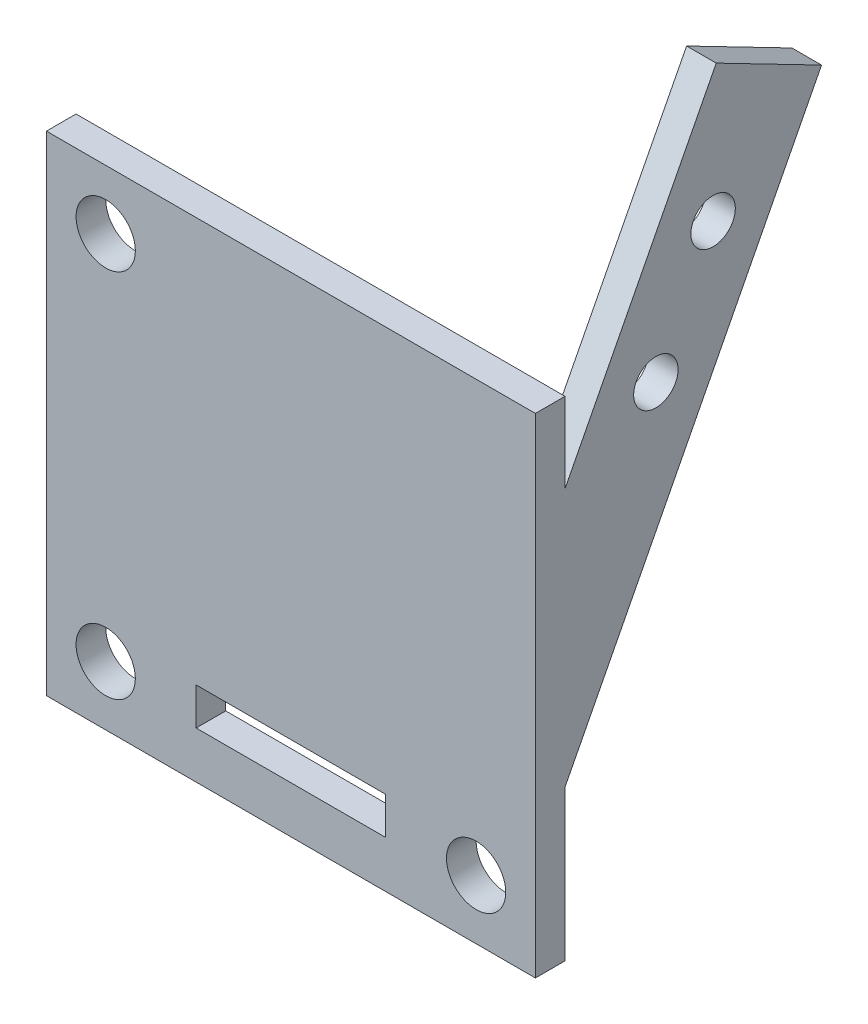
ISO-10303-21;
HEADER;
FILE_DESCRIPTION(('STEP AP214'),'2;1');
FILE_NAME('part.step','',(''),(''),'','','');
FILE_SCHEMA(('AUTOMOTIVE_DESIGN { 1 0 10303 214 1 1 1 1 }'));
ENDSEC;
DATA;
#1=APPLICATION_CONTEXT('core data for automotive mechanical design processes');
#2=APPLICATION_PROTOCOL_DEFINITION('international standard','automotive_design',2000,#1);
#3=PRODUCT_CONTEXT('',#1,'mechanical');
#4=PRODUCT('Part','Part','',(#3));
#5=PRODUCT_RELATED_PRODUCT_CATEGORY('part','',(#4));
#6=PRODUCT_DEFINITION_FORMATION('','',#4);
#7=PRODUCT_DEFINITION_CONTEXT('part definition',#1,'design');
#8=PRODUCT_DEFINITION('design','',#6,#7);
#9=PRODUCT_DEFINITION_SHAPE('','',#8);
#10=(LENGTH_UNIT() NAMED_UNIT(*) SI_UNIT(.MILLI.,.METRE.));
#11=(NAMED_UNIT(*) PLANE_ANGLE_UNIT() SI_UNIT($,.RADIAN.));
#12=(NAMED_UNIT(*) SI_UNIT($,.STERADIAN.) SOLID_ANGLE_UNIT());
#13=UNCERTAINTY_MEASURE_WITH_UNIT(LENGTH_MEASURE(1.E-05),#10,'distance_accuracy_value','');
#14=(GEOMETRIC_REPRESENTATION_CONTEXT(3) GLOBAL_UNCERTAINTY_ASSIGNED_CONTEXT((#13)) GLOBAL_UNIT_ASSIGNED_CONTEXT((#10,
#11,#12)) REPRESENTATION_CONTEXT('',''));
#15=CARTESIAN_POINT('',(0.,0.,0.));
#16=DIRECTION('',(0.,0.,1.));
#17=DIRECTION('',(1.,0.,0.));
#18=AXIS2_PLACEMENT_3D('',#15,#16,#17);
#19=CARTESIAN_POINT('',(0.,0.,0.));
#20=DIRECTION('',(0.,0.,1.));
#21=DIRECTION('',(1.,0.,0.));
#22=AXIS2_PLACEMENT_3D('',#19,#20,#21);
#23=PLANE('',#22);
#24=CARTESIAN_POINT('',(-12.5,12.5,0.));
#25=DIRECTION('',(0.,0.,-1.));
#26=DIRECTION('',(-1.,0.,0.));
#27=AXIS2_PLACEMENT_3D('',#24,#25,#26);
#28=CIRCLE('',#27,2.);
#29=CARTESIAN_POINT('',(-14.5,12.5,0.));
#30=VERTEX_POINT('',#29);
#31=EDGE_CURVE('E300',#30,#30,#28,.T.);
#32=ORIENTED_EDGE('',*,*,#31,.F.);
#33=EDGE_LOOP('',(#32));
#34=FACE_BOUND('',#33,.T.);
#35=CARTESIAN_POINT('',(-12.5,-12.5,0.));
#36=DIRECTION('',(0.,0.,-1.));
#37=DIRECTION('',(-1.,0.,0.));
#38=AXIS2_PLACEMENT_3D('',#35,#36,#37);
#39=CIRCLE('',#38,2.);
#40=CARTESIAN_POINT('',(-14.5,-12.5,0.));
#41=VERTEX_POINT('',#40);
#42=EDGE_CURVE('E290',#41,#41,#39,.T.);
#43=ORIENTED_EDGE('',*,*,#42,.F.);
#44=EDGE_LOOP('',(#43));
#45=FACE_BOUND('',#44,.T.);
#46=CARTESIAN_POINT('',(12.5,-12.5,0.));
#47=DIRECTION('',(0.,0.,-1.));
#48=DIRECTION('',(-1.,0.,0.));
#49=AXIS2_PLACEMENT_3D('',#46,#47,#48);
#50=CIRCLE('',#49,2.);
#51=CARTESIAN_POINT('',(10.5,-12.5,0.));
#52=VERTEX_POINT('',#51);
#53=EDGE_CURVE('E291',#52,#52,#50,.T.);
#54=ORIENTED_EDGE('',*,*,#53,.F.);
#55=EDGE_LOOP('',(#54));
#56=FACE_BOUND('',#55,.T.);
#57=DIRECTION('',(0.,-1.,0.));
#58=VECTOR('',#57,1.);
#59=CARTESIAN_POINT('',(6.39907242727323,-10.8175668460402,0.));
#60=LINE('',#59,#58);
#61=CARTESIAN_POINT('',(6.39907242727323,-10.8175668460402,0.));
#62=VERTEX_POINT('',#61);
#63=CARTESIAN_POINT('',(6.39907242727323,-13.3374088381271,0.));
#64=VERTEX_POINT('',#63);
#65=EDGE_CURVE('E146',#62,#64,#60,.T.);
#66=ORIENTED_EDGE('',*,*,#65,.F.);
#67=DIRECTION('',(1.,0.,0.));
#68=VECTOR('',#67,1.);
#69=CARTESIAN_POINT('',(6.39907242727323,-10.8175668460402,0.));
#70=LINE('',#69,#68);
#71=CARTESIAN_POINT('',(-6.39907242727323,-10.8175668460402,0.));
#72=VERTEX_POINT('',#71);
#73=EDGE_CURVE('E139',#72,#62,#70,.T.);
#74=ORIENTED_EDGE('',*,*,#73,.F.);
#75=DIRECTION('',(0.,1.,0.));
#76=VECTOR('',#75,1.);
#77=CARTESIAN_POINT('',(-6.39907242727323,-10.8175668460402,0.));
#78=LINE('',#77,#76);
#79=CARTESIAN_POINT('',(-6.39907242727323,-13.3374088381271,0.));
#80=VERTEX_POINT('',#79);
#81=EDGE_CURVE('E150',#80,#72,#78,.T.);
#82=ORIENTED_EDGE('',*,*,#81,.F.);
#83=DIRECTION('',(-1.,0.,0.));
#84=VECTOR('',#83,1.);
#85=CARTESIAN_POINT('',(6.39907242727323,-13.3374088381271,0.));
#86=LINE('',#85,#84);
#87=EDGE_CURVE('E48',#64,#80,#86,.T.);
#88=ORIENTED_EDGE('',*,*,#87,.F.);
#89=EDGE_LOOP('',(#66,#74,#82,#88));
#90=FACE_BOUND('',#89,.T.);
#91=DIRECTION('',(1.,0.,0.));
#92=VECTOR('',#91,1.);
#93=CARTESIAN_POINT('',(14.5,11.1002225544745,0.));
#94=LINE('',#93,#92);
#95=CARTESIAN_POINT('',(14.5,11.1002225544745,0.));
#96=VERTEX_POINT('',#95);
#97=CARTESIAN_POINT('',(16.5,11.1002225544745,0.));
#98=VERTEX_POINT('',#97);
#99=EDGE_CURVE('E196',#96,#98,#94,.T.);
#100=ORIENTED_EDGE('',*,*,#99,.F.);
#101=DIRECTION('',(0.,-1.,0.));
#102=VECTOR('',#101,1.);
#103=CARTESIAN_POINT('',(14.5,11.1002225544745,0.));
#104=LINE('',#103,#102);
#105=CARTESIAN_POINT('',(14.5,-6.34228866521879,0.));
#106=VERTEX_POINT('',#105);
#107=EDGE_CURVE('E182',#96,#106,#104,.T.);
#108=ORIENTED_EDGE('',*,*,#107,.T.);
#109=DIRECTION('',(1.,0.,0.));
#110=VECTOR('',#109,1.);
#111=CARTESIAN_POINT('',(14.5,-6.34228866521879,0.));
#112=LINE('',#111,#110);
#113=CARTESIAN_POINT('',(16.5,-6.34228866521878,0.));
#114=VERTEX_POINT('',#113);
#115=EDGE_CURVE('E192',#106,#114,#112,.T.);
#116=ORIENTED_EDGE('',*,*,#115,.T.);
#117=DIRECTION('',(0.,1.,0.));
#118=VECTOR('',#117,1.);
#119=CARTESIAN_POINT('',(16.5,16.5,0.));
#120=LINE('',#119,#118);
#121=CARTESIAN_POINT('',(16.5,-16.5,0.));
#122=VERTEX_POINT('',#121);
#123=EDGE_CURVE('E213',#122,#114,#120,.T.);
#124=ORIENTED_EDGE('',*,*,#123,.F.);
#125=DIRECTION('',(1.,0.,0.));
#126=VECTOR('',#125,1.);
#127=CARTESIAN_POINT('',(-16.5,-16.5,0.));
#128=LINE('',#127,#126);
#129=CARTESIAN_POINT('',(-16.5,-16.5,0.));
#130=VERTEX_POINT('',#129);
#131=EDGE_CURVE('E206',#130,#122,#128,.T.);
#132=ORIENTED_EDGE('',*,*,#131,.F.);
#133=DIRECTION('',(0.,-1.,0.));
#134=VECTOR('',#133,1.);
#135=CARTESIAN_POINT('',(-16.5,16.5,0.));
#136=LINE('',#135,#134);
#137=CARTESIAN_POINT('',(-16.5,16.5,0.));
#138=VERTEX_POINT('',#137);
#139=EDGE_CURVE('E218',#138,#130,#136,.T.);
#140=ORIENTED_EDGE('',*,*,#139,.F.);
#141=DIRECTION('',(-1.,0.,0.));
#142=VECTOR('',#141,1.);
#143=CARTESIAN_POINT('',(-16.5,16.5,0.));
#144=LINE('',#143,#142);
#145=CARTESIAN_POINT('',(16.5,16.5,0.));
#146=VERTEX_POINT('',#145);
#147=EDGE_CURVE('E216',#146,#138,#144,.T.);
#148=ORIENTED_EDGE('',*,*,#147,.F.);
#149=EDGE_CURVE('E195',#98,#146,#120,.T.);
#150=ORIENTED_EDGE('',*,*,#149,.F.);
#151=EDGE_LOOP('',(#100,#108,#116,#124,#132,#140,#148,#150));
#152=FACE_BOUND('',#151,.T.);
#153=ADVANCED_FACE('F33',(#34,#45,#56,#90,#152),#23,.F.);
#154=CARTESIAN_POINT('',(16.5,16.5,2.));
#155=DIRECTION('',(-1.,0.,0.));
#156=DIRECTION('',(0.,0.,1.));
#157=AXIS2_PLACEMENT_3D('',#154,#155,#156);
#158=PLANE('',#157);
#159=CARTESIAN_POINT('',(16.5,21.7430272293726,-9.99453678843321));
#160=DIRECTION('',(1.,0.,0.));
#161=DIRECTION('',(0.,0.,-1.));
#162=AXIS2_PLACEMENT_3D('',#159,#160,#161);
#163=CIRCLE('',#162,1.5);
#164=CARTESIAN_POINT('',(16.5,21.7430272293726,-11.4945367884332));
#165=VERTEX_POINT('',#164);
#166=EDGE_CURVE('E159',#165,#165,#163,.T.);
#167=ORIENTED_EDGE('',*,*,#166,.F.);
#168=EDGE_LOOP('',(#167));
#169=FACE_BOUND('',#168,.T.);
#170=CARTESIAN_POINT('',(16.5,14.2585598983655,-6.13151513999784));
#171=DIRECTION('',(1.,0.,0.));
#172=DIRECTION('',(0.,0.,-1.));
#173=AXIS2_PLACEMENT_3D('',#170,#171,#172);
#174=CIRCLE('',#173,1.5);
#175=CARTESIAN_POINT('',(16.5,14.2585598983655,-7.63151513999784));
#176=VERTEX_POINT('',#175);
#177=EDGE_CURVE('E165',#176,#176,#174,.T.);
#178=ORIENTED_EDGE('',*,*,#177,.F.);
#179=EDGE_LOOP('',(#178));
#180=FACE_BOUND('',#179,.T.);
#181=ORIENTED_EDGE('',*,*,#123,.T.);
#182=DIRECTION('',(0.,0.888617232654948,-0.458649554484316));
#183=VECTOR('',#182,1.);
#184=CARTESIAN_POINT('',(16.5,0.544368726690588,-3.55446893061979));
#185=LINE('',#184,#183);
#186=CARTESIAN_POINT('',(16.5,27.202885706339,-17.3139555651493));
#187=VERTEX_POINT('',#186);
#188=EDGE_CURVE('E176',#114,#187,#185,.T.);
#189=ORIENTED_EDGE('',*,*,#188,.T.);
#190=DIRECTION('',(0.,0.458649554484316,0.888617232654948));
#191=VECTOR('',#190,1.);
#192=CARTESIAN_POINT('',(16.5,30.8720821422136,-10.2050177039097));
#193=LINE('',#192,#191);
#194=CARTESIAN_POINT('',(16.5,30.8720821422136,-10.2050177039097));
#195=VERTEX_POINT('',#194);
#196=EDGE_CURVE('E171',#187,#195,#193,.T.);
#197=ORIENTED_EDGE('',*,*,#196,.T.);
#198=DIRECTION('',(0.,-0.888617232654948,0.458649554484316));
#199=VECTOR('',#198,1.);
#200=CARTESIAN_POINT('',(16.5,11.1002225544745,0.));
#201=LINE('',#200,#199);
#202=EDGE_CURVE('E188',#195,#98,#201,.T.);
#203=ORIENTED_EDGE('',*,*,#202,.T.);
#204=ORIENTED_EDGE('',*,*,#149,.T.);
#205=DIRECTION('',(0.,0.,-1.));
#206=VECTOR('',#205,1.);
#207=CARTESIAN_POINT('',(16.5,16.5,2.));
#208=LINE('',#207,#206);
#209=CARTESIAN_POINT('',(16.5,16.5,2.));
#210=VERTEX_POINT('',#209);
#211=EDGE_CURVE('E11',#210,#146,#208,.T.);
#212=ORIENTED_EDGE('',*,*,#211,.F.);
#213=DIRECTION('',(0.,1.,0.));
#214=VECTOR('',#213,1.);
#215=CARTESIAN_POINT('',(16.5,16.5,2.));
#216=LINE('',#215,#214);
#217=CARTESIAN_POINT('',(16.5,-16.5,2.));
#218=VERTEX_POINT('',#217);
#219=EDGE_CURVE('E202',#218,#210,#216,.T.);
#220=ORIENTED_EDGE('',*,*,#219,.F.);
#221=DIRECTION('',(0.,0.,-1.));
#222=VECTOR('',#221,1.);
#223=CARTESIAN_POINT('',(16.5,-16.5,2.));
#224=LINE('',#223,#222);
#225=EDGE_CURVE('E212',#218,#122,#224,.T.);
#226=ORIENTED_EDGE('',*,*,#225,.T.);
#227=EDGE_LOOP('',(#181,#189,#197,#203,#204,#212,#220,#226));
#228=FACE_BOUND('',#227,.T.);
#229=ADVANCED_FACE('F35',(#169,#180,#228),#158,.F.);
#230=CARTESIAN_POINT('',(-16.5,16.5,2.));
#231=DIRECTION('',(0.,-1.,0.));
#232=DIRECTION('',(0.,0.,-1.));
#233=AXIS2_PLACEMENT_3D('',#230,#231,#232);
#234=PLANE('',#233);
#235=ORIENTED_EDGE('',*,*,#147,.T.);
#236=DIRECTION('',(0.,0.,-1.));
#237=VECTOR('',#236,1.);
#238=CARTESIAN_POINT('',(-16.5,16.5,2.));
#239=LINE('',#238,#237);
#240=CARTESIAN_POINT('',(-16.5,16.5,2.));
#241=VERTEX_POINT('',#240);
#242=EDGE_CURVE('E41',#241,#138,#239,.T.);
#243=ORIENTED_EDGE('',*,*,#242,.F.);
#244=DIRECTION('',(-1.,0.,0.));
#245=VECTOR('',#244,1.);
#246=CARTESIAN_POINT('',(-16.5,16.5,2.));
#247=LINE('',#246,#245);
#248=EDGE_CURVE('E205',#210,#241,#247,.T.);
#249=ORIENTED_EDGE('',*,*,#248,.F.);
#250=ORIENTED_EDGE('',*,*,#211,.T.);
#251=EDGE_LOOP('',(#235,#243,#249,#250));
#252=FACE_BOUND('',#251,.T.);
#253=ADVANCED_FACE('F246',(#252),#234,.F.);
#254=CARTESIAN_POINT('',(-16.5,16.5,2.));
#255=DIRECTION('',(1.,0.,0.));
#256=DIRECTION('',(0.,1.,0.));
#257=AXIS2_PLACEMENT_3D('',#254,#255,#256);
#258=PLANE('',#257);
#259=ORIENTED_EDGE('',*,*,#139,.T.);
#260=DIRECTION('',(0.,0.,-1.));
#261=VECTOR('',#260,1.);
#262=CARTESIAN_POINT('',(-16.5,-16.5,2.));
#263=LINE('',#262,#261);
#264=CARTESIAN_POINT('',(-16.5,-16.5,2.));
#265=VERTEX_POINT('',#264);
#266=EDGE_CURVE('E223',#265,#130,#263,.T.);
#267=ORIENTED_EDGE('',*,*,#266,.F.);
#268=DIRECTION('',(0.,-1.,0.));
#269=VECTOR('',#268,1.);
#270=CARTESIAN_POINT('',(-16.5,16.5,2.));
#271=LINE('',#270,#269);
#272=EDGE_CURVE('E208',#241,#265,#271,.T.);
#273=ORIENTED_EDGE('',*,*,#272,.F.);
#274=ORIENTED_EDGE('',*,*,#242,.T.);
#275=EDGE_LOOP('',(#259,#267,#273,#274));
#276=FACE_BOUND('',#275,.T.);
#277=ADVANCED_FACE('F230',(#276),#258,.F.);
#278=CARTESIAN_POINT('',(-16.5,-16.5,2.));
#279=DIRECTION('',(0.,1.,0.));
#280=DIRECTION('',(0.,0.,1.));
#281=AXIS2_PLACEMENT_3D('',#278,#279,#280);
#282=PLANE('',#281);
#283=ORIENTED_EDGE('',*,*,#131,.T.);
#284=ORIENTED_EDGE('',*,*,#225,.F.);
#285=DIRECTION('',(1.,0.,0.));
#286=VECTOR('',#285,1.);
#287=CARTESIAN_POINT('',(-16.5,-16.5,2.));
#288=LINE('',#287,#286);
#289=EDGE_CURVE('E210',#265,#218,#288,.T.);
#290=ORIENTED_EDGE('',*,*,#289,.F.);
#291=ORIENTED_EDGE('',*,*,#266,.T.);
#292=EDGE_LOOP('',(#283,#284,#290,#291));
#293=FACE_BOUND('',#292,.T.);
#294=ADVANCED_FACE('F241',(#293),#282,.F.);
#295=CARTESIAN_POINT('',(0.,0.,2.));
#296=DIRECTION('',(0.,0.,1.));
#297=DIRECTION('',(1.,0.,0.));
#298=AXIS2_PLACEMENT_3D('',#295,#296,#297);
#299=PLANE('',#298);
#300=CARTESIAN_POINT('',(-12.5,12.5,2.));
#301=DIRECTION('',(0.,0.,1.));
#302=DIRECTION('',(1.,0.,0.));
#303=AXIS2_PLACEMENT_3D('',#300,#301,#302);
#304=CIRCLE('',#303,2.);
#305=CARTESIAN_POINT('',(-10.5,12.5,2.));
#306=VERTEX_POINT('',#305);
#307=EDGE_CURVE('E281',#306,#306,#304,.F.);
#308=ORIENTED_EDGE('',*,*,#307,.T.);
#309=EDGE_LOOP('',(#308));
#310=FACE_BOUND('',#309,.T.);
#311=CARTESIAN_POINT('',(-12.5,-12.5,2.));
#312=DIRECTION('',(0.,0.,1.));
#313=DIRECTION('',(1.,0.,0.));
#314=AXIS2_PLACEMENT_3D('',#311,#312,#313);
#315=CIRCLE('',#314,2.);
#316=CARTESIAN_POINT('',(-10.5,-12.5,2.));
#317=VERTEX_POINT('',#316);
#318=EDGE_CURVE('E285',#317,#317,#315,.F.);
#319=ORIENTED_EDGE('',*,*,#318,.T.);
#320=EDGE_LOOP('',(#319));
#321=FACE_BOUND('',#320,.T.);
#322=CARTESIAN_POINT('',(12.5,-12.5,2.));
#323=DIRECTION('',(0.,0.,1.));
#324=DIRECTION('',(1.,0.,0.));
#325=AXIS2_PLACEMENT_3D('',#322,#323,#324);
#326=CIRCLE('',#325,2.);
#327=CARTESIAN_POINT('',(14.5,-12.5,2.));
#328=VERTEX_POINT('',#327);
#329=EDGE_CURVE('E288',#328,#328,#326,.F.);
#330=ORIENTED_EDGE('',*,*,#329,.T.);
#331=EDGE_LOOP('',(#330));
#332=FACE_BOUND('',#331,.T.);
#333=DIRECTION('',(1.,0.,0.));
#334=VECTOR('',#333,1.);
#335=CARTESIAN_POINT('',(6.39907242727323,-10.8175668460402,2.));
#336=LINE('',#335,#334);
#337=CARTESIAN_POINT('',(-6.39907242727323,-10.8175668460402,2.));
#338=VERTEX_POINT('',#337);
#339=CARTESIAN_POINT('',(6.39907242727323,-10.8175668460402,2.));
#340=VERTEX_POINT('',#339);
#341=EDGE_CURVE('E136',#338,#340,#336,.T.);
#342=ORIENTED_EDGE('',*,*,#341,.T.);
#343=DIRECTION('',(0.,-1.,0.));
#344=VECTOR('',#343,1.);
#345=CARTESIAN_POINT('',(6.39907242727323,-10.8175668460402,2.));
#346=LINE('',#345,#344);
#347=CARTESIAN_POINT('',(6.39907242727323,-13.3374088381271,2.));
#348=VERTEX_POINT('',#347);
#349=EDGE_CURVE('E123',#340,#348,#346,.T.);
#350=ORIENTED_EDGE('',*,*,#349,.T.);
#351=DIRECTION('',(-1.,0.,0.));
#352=VECTOR('',#351,1.);
#353=CARTESIAN_POINT('',(6.39907242727323,-13.3374088381271,2.));
#354=LINE('',#353,#352);
#355=CARTESIAN_POINT('',(-6.39907242727323,-13.3374088381271,2.));
#356=VERTEX_POINT('',#355);
#357=EDGE_CURVE('E154',#348,#356,#354,.T.);
#358=ORIENTED_EDGE('',*,*,#357,.T.);
#359=DIRECTION('',(0.,1.,0.));
#360=VECTOR('',#359,1.);
#361=CARTESIAN_POINT('',(-6.39907242727323,-10.8175668460402,2.));
#362=LINE('',#361,#360);
#363=EDGE_CURVE('E144',#356,#338,#362,.T.);
#364=ORIENTED_EDGE('',*,*,#363,.T.);
#365=EDGE_LOOP('',(#342,#350,#358,#364));
#366=FACE_BOUND('',#365,.T.);
#367=ORIENTED_EDGE('',*,*,#219,.T.);
#368=ORIENTED_EDGE('',*,*,#248,.T.);
#369=ORIENTED_EDGE('',*,*,#272,.T.);
#370=ORIENTED_EDGE('',*,*,#289,.T.);
#371=EDGE_LOOP('',(#367,#368,#369,#370));
#372=FACE_BOUND('',#371,.T.);
#373=ADVANCED_FACE('F142',(#310,#321,#332,#366,#372),#299,.T.);
#374=CARTESIAN_POINT('',(14.5,0.544368726690588,-3.55446893061979));
#375=DIRECTION('',(0.,-0.458649554484316,-0.888617232654948));
#376=DIRECTION('',(0.,0.888617232654949,-0.458649554484316));
#377=AXIS2_PLACEMENT_3D('',#374,#375,#376);
#378=PLANE('',#377);
#379=ORIENTED_EDGE('',*,*,#188,.F.);
#380=ORIENTED_EDGE('',*,*,#115,.F.);
#381=DIRECTION('',(0.,0.888617232654948,-0.458649554484316));
#382=VECTOR('',#381,1.);
#383=CARTESIAN_POINT('',(14.5,0.544368726690588,-3.55446893061979));
#384=LINE('',#383,#382);
#385=CARTESIAN_POINT('',(14.5,27.202885706339,-17.3139555651493));
#386=VERTEX_POINT('',#385);
#387=EDGE_CURVE('E172',#106,#386,#384,.T.);
#388=ORIENTED_EDGE('',*,*,#387,.T.);
#389=DIRECTION('',(1.,0.,0.));
#390=VECTOR('',#389,1.);
#391=CARTESIAN_POINT('',(14.5,27.202885706339,-17.3139555651493));
#392=LINE('',#391,#390);
#393=EDGE_CURVE('E185',#386,#187,#392,.T.);
#394=ORIENTED_EDGE('',*,*,#393,.T.);
#395=EDGE_LOOP('',(#379,#380,#388,#394));
#396=FACE_BOUND('',#395,.T.);
#397=ADVANCED_FACE('F270',(#396),#378,.T.);
#398=CARTESIAN_POINT('',(14.5,11.1002225544745,0.));
#399=DIRECTION('',(0.,0.458649554484316,0.888617232654948));
#400=DIRECTION('',(0.,-0.888617232654948,0.458649554484316));
#401=AXIS2_PLACEMENT_3D('',#398,#399,#400);
#402=PLANE('',#401);
#403=ORIENTED_EDGE('',*,*,#202,.F.);
#404=DIRECTION('',(1.,0.,0.));
#405=VECTOR('',#404,1.);
#406=CARTESIAN_POINT('',(14.5,30.8720821422136,-10.2050177039097));
#407=LINE('',#406,#405);
#408=CARTESIAN_POINT('',(14.5,30.8720821422136,-10.2050177039097));
#409=VERTEX_POINT('',#408);
#410=EDGE_CURVE('E198',#409,#195,#407,.T.);
#411=ORIENTED_EDGE('',*,*,#410,.F.);
#412=DIRECTION('',(0.,-0.888617232654948,0.458649554484316));
#413=VECTOR('',#412,1.);
#414=CARTESIAN_POINT('',(14.5,11.1002225544745,0.));
#415=LINE('',#414,#413);
#416=EDGE_CURVE('E179',#409,#96,#415,.T.);
#417=ORIENTED_EDGE('',*,*,#416,.T.);
#418=ORIENTED_EDGE('',*,*,#99,.T.);
#419=EDGE_LOOP('',(#403,#411,#417,#418));
#420=FACE_BOUND('',#419,.T.);
#421=ADVANCED_FACE('F275',(#420),#402,.T.);
#422=CARTESIAN_POINT('',(14.5,30.8720821422136,-10.2050177039097));
#423=DIRECTION('',(0.,0.888617232654948,-0.458649554484316));
#424=DIRECTION('',(0.,0.458649554484316,0.888617232654948));
#425=AXIS2_PLACEMENT_3D('',#422,#423,#424);
#426=PLANE('',#425);
#427=ORIENTED_EDGE('',*,*,#196,.F.);
#428=ORIENTED_EDGE('',*,*,#393,.F.);
#429=DIRECTION('',(0.,0.458649554484316,0.888617232654948));
#430=VECTOR('',#429,1.);
#431=CARTESIAN_POINT('',(14.5,30.8720821422136,-10.2050177039097));
#432=LINE('',#431,#430);
#433=EDGE_CURVE('E175',#386,#409,#432,.T.);
#434=ORIENTED_EDGE('',*,*,#433,.T.);
#435=ORIENTED_EDGE('',*,*,#410,.T.);
#436=EDGE_LOOP('',(#427,#428,#434,#435));
#437=FACE_BOUND('',#436,.T.);
#438=ADVANCED_FACE('F340',(#437),#426,.T.);
#439=CARTESIAN_POINT('',(14.5,0.,0.));
#440=DIRECTION('',(-1.,0.,0.));
#441=DIRECTION('',(0.,0.,1.));
#442=AXIS2_PLACEMENT_3D('',#439,#440,#441);
#443=PLANE('',#442);
#444=CARTESIAN_POINT('',(14.5,21.7430272293726,-9.99453678843321));
#445=DIRECTION('',(-1.,0.,0.));
#446=DIRECTION('',(0.,0.,1.));
#447=AXIS2_PLACEMENT_3D('',#444,#445,#446);
#448=CIRCLE('',#447,1.5);
#449=CARTESIAN_POINT('',(14.5,21.7430272293726,-8.49453678843321));
#450=VERTEX_POINT('',#449);
#451=EDGE_CURVE('E162',#450,#450,#448,.F.);
#452=ORIENTED_EDGE('',*,*,#451,.T.);
#453=EDGE_LOOP('',(#452));
#454=FACE_BOUND('',#453,.T.);
#455=CARTESIAN_POINT('',(14.5,14.2585598983655,-6.13151513999784));
#456=DIRECTION('',(-1.,0.,0.));
#457=DIRECTION('',(0.,0.,1.));
#458=AXIS2_PLACEMENT_3D('',#455,#456,#457);
#459=CIRCLE('',#458,1.5);
#460=CARTESIAN_POINT('',(14.5,14.2585598983655,-4.63151513999784));
#461=VERTEX_POINT('',#460);
#462=EDGE_CURVE('E168',#461,#461,#459,.F.);
#463=ORIENTED_EDGE('',*,*,#462,.T.);
#464=EDGE_LOOP('',(#463));
#465=FACE_BOUND('',#464,.T.);
#466=ORIENTED_EDGE('',*,*,#387,.F.);
#467=ORIENTED_EDGE('',*,*,#107,.F.);
#468=ORIENTED_EDGE('',*,*,#416,.F.);
#469=ORIENTED_EDGE('',*,*,#433,.F.);
#470=EDGE_LOOP('',(#466,#467,#468,#469));
#471=FACE_BOUND('',#470,.T.);
#472=ADVANCED_FACE('F337',(#454,#465,#471),#443,.T.);
#473=CARTESIAN_POINT('',(10.2573593128807,14.2585598983655,-6.13151513999784));
#474=DIRECTION('',(1.,0.,0.));
#475=DIRECTION('',(0.,0.,-1.));
#476=AXIS2_PLACEMENT_3D('',#473,#474,#475);
#477=CYLINDRICAL_SURFACE('',#476,1.5);
#478=ORIENTED_EDGE('',*,*,#177,.T.);
#479=EDGE_LOOP('',(#478));
#480=FACE_BOUND('',#479,.T.);
#481=ORIENTED_EDGE('',*,*,#462,.F.);
#482=EDGE_LOOP('',(#481));
#483=FACE_BOUND('',#482,.T.);
#484=ADVANCED_FACE('F333',(#480,#483),#477,.F.);
#485=CARTESIAN_POINT('',(10.2573593128807,21.7430272293726,-9.99453678843321));
#486=DIRECTION('',(1.,0.,0.));
#487=DIRECTION('',(0.,0.,-1.));
#488=AXIS2_PLACEMENT_3D('',#485,#486,#487);
#489=CYLINDRICAL_SURFACE('',#488,1.5);
#490=ORIENTED_EDGE('',*,*,#166,.T.);
#491=EDGE_LOOP('',(#490));
#492=FACE_BOUND('',#491,.T.);
#493=ORIENTED_EDGE('',*,*,#451,.F.);
#494=EDGE_LOOP('',(#493));
#495=FACE_BOUND('',#494,.T.);
#496=ADVANCED_FACE('F330',(#492,#495),#489,.F.);
#497=CARTESIAN_POINT('',(6.39907242727323,-10.8175668460402,15.0438535480524));
#498=DIRECTION('',(0.,1.,0.));
#499=DIRECTION('',(0.,0.,1.));
#500=AXIS2_PLACEMENT_3D('',#497,#498,#499);
#501=PLANE('',#500);
#502=DIRECTION('',(0.,0.,-1.));
#503=VECTOR('',#502,1.);
#504=CARTESIAN_POINT('',(-6.39907242727323,-10.8175668460402,15.0438535480524));
#505=LINE('',#504,#503);
#506=EDGE_CURVE('E56',#338,#72,#505,.T.);
#507=ORIENTED_EDGE('',*,*,#506,.T.);
#508=ORIENTED_EDGE('',*,*,#73,.T.);
#509=DIRECTION('',(0.,0.,-1.));
#510=VECTOR('',#509,1.);
#511=CARTESIAN_POINT('',(6.39907242727323,-10.8175668460402,15.0438535480524));
#512=LINE('',#511,#510);
#513=EDGE_CURVE('E127',#340,#62,#512,.T.);
#514=ORIENTED_EDGE('',*,*,#513,.F.);
#515=ORIENTED_EDGE('',*,*,#341,.F.);
#516=EDGE_LOOP('',(#507,#508,#514,#515));
#517=FACE_BOUND('',#516,.T.);
#518=ADVANCED_FACE('F135',(#517),#501,.F.);
#519=CARTESIAN_POINT('',(6.39907242727323,-10.8175668460402,15.0438535480524));
#520=DIRECTION('',(1.,0.,0.));
#521=DIRECTION('',(0.,0.,-1.));
#522=AXIS2_PLACEMENT_3D('',#519,#520,#521);
#523=PLANE('',#522);
#524=ORIENTED_EDGE('',*,*,#513,.T.);
#525=ORIENTED_EDGE('',*,*,#65,.T.);
#526=DIRECTION('',(0.,0.,-1.));
#527=VECTOR('',#526,1.);
#528=CARTESIAN_POINT('',(6.39907242727323,-13.3374088381271,15.0438535480524));
#529=LINE('',#528,#527);
#530=EDGE_CURVE('E129',#348,#64,#529,.T.);
#531=ORIENTED_EDGE('',*,*,#530,.F.);
#532=ORIENTED_EDGE('',*,*,#349,.F.);
#533=EDGE_LOOP('',(#524,#525,#531,#532));
#534=FACE_BOUND('',#533,.T.);
#535=ADVANCED_FACE('F125',(#534),#523,.F.);
#536=CARTESIAN_POINT('',(6.39907242727323,-13.3374088381271,15.0438535480524));
#537=DIRECTION('',(0.,-1.,0.));
#538=DIRECTION('',(0.,0.,-1.));
#539=AXIS2_PLACEMENT_3D('',#536,#537,#538);
#540=PLANE('',#539);
#541=ORIENTED_EDGE('',*,*,#530,.T.);
#542=ORIENTED_EDGE('',*,*,#87,.T.);
#543=DIRECTION('',(0.,0.,-1.));
#544=VECTOR('',#543,1.);
#545=CARTESIAN_POINT('',(-6.39907242727323,-13.3374088381271,15.0438535480524));
#546=LINE('',#545,#544);
#547=EDGE_CURVE('E153',#356,#80,#546,.T.);
#548=ORIENTED_EDGE('',*,*,#547,.F.);
#549=ORIENTED_EDGE('',*,*,#357,.F.);
#550=EDGE_LOOP('',(#541,#542,#548,#549));
#551=FACE_BOUND('',#550,.T.);
#552=ADVANCED_FACE('F323',(#551),#540,.F.);
#553=CARTESIAN_POINT('',(-6.39907242727323,-10.8175668460402,15.0438535480524));
#554=DIRECTION('',(-1.,0.,0.));
#555=DIRECTION('',(0.,0.,1.));
#556=AXIS2_PLACEMENT_3D('',#553,#554,#555);
#557=PLANE('',#556);
#558=ORIENTED_EDGE('',*,*,#547,.T.);
#559=ORIENTED_EDGE('',*,*,#81,.T.);
#560=ORIENTED_EDGE('',*,*,#506,.F.);
#561=ORIENTED_EDGE('',*,*,#363,.F.);
#562=EDGE_LOOP('',(#558,#559,#560,#561));
#563=FACE_BOUND('',#562,.T.);
#564=ADVANCED_FACE('F319',(#563),#557,.F.);
#565=CARTESIAN_POINT('',(12.5,-12.5,15.0438535480524));
#566=DIRECTION('',(0.,0.,-1.));
#567=DIRECTION('',(-1.,0.,0.));
#568=AXIS2_PLACEMENT_3D('',#565,#566,#567);
#569=CYLINDRICAL_SURFACE('',#568,2.);
#570=ORIENTED_EDGE('',*,*,#53,.T.);
#571=EDGE_LOOP('',(#570));
#572=FACE_BOUND('',#571,.T.);
#573=ORIENTED_EDGE('',*,*,#329,.F.);
#574=EDGE_LOOP('',(#573));
#575=FACE_BOUND('',#574,.T.);
#576=ADVANCED_FACE('F313',(#572,#575),#569,.F.);
#577=CARTESIAN_POINT('',(-12.5,-12.5,15.0438535480524));
#578=DIRECTION('',(0.,0.,-1.));
#579=DIRECTION('',(-1.,0.,0.));
#580=AXIS2_PLACEMENT_3D('',#577,#578,#579);
#581=CYLINDRICAL_SURFACE('',#580,2.);
#582=ORIENTED_EDGE('',*,*,#42,.T.);
#583=EDGE_LOOP('',(#582));
#584=FACE_BOUND('',#583,.T.);
#585=ORIENTED_EDGE('',*,*,#318,.F.);
#586=EDGE_LOOP('',(#585));
#587=FACE_BOUND('',#586,.T.);
#588=ADVANCED_FACE('F308',(#584,#587),#581,.F.);
#589=CARTESIAN_POINT('',(-12.5,12.5,15.0438535480524));
#590=DIRECTION('',(0.,0.,-1.));
#591=DIRECTION('',(-1.,0.,0.));
#592=AXIS2_PLACEMENT_3D('',#589,#590,#591);
#593=CYLINDRICAL_SURFACE('',#592,2.);
#594=ORIENTED_EDGE('',*,*,#31,.T.);
#595=EDGE_LOOP('',(#594));
#596=FACE_BOUND('',#595,.T.);
#597=ORIENTED_EDGE('',*,*,#307,.F.);
#598=EDGE_LOOP('',(#597));
#599=FACE_BOUND('',#598,.T.);
#600=ADVANCED_FACE('F305',(#596,#599),#593,.F.);
#601=CLOSED_SHELL('',(#153,#229,#253,#277,#294,#373,#397,#421,#438,#472,#484,#496,#518,#535,
#552,#564,#576,#588,#600));
#602=MANIFOLD_SOLID_BREP('B2',#601);
#603=ADVANCED_BREP_SHAPE_REPRESENTATION('',(#18,#602),#14);
#604=SHAPE_DEFINITION_REPRESENTATION(#9,#603);
ENDSEC;
END-ISO-10303-21;
